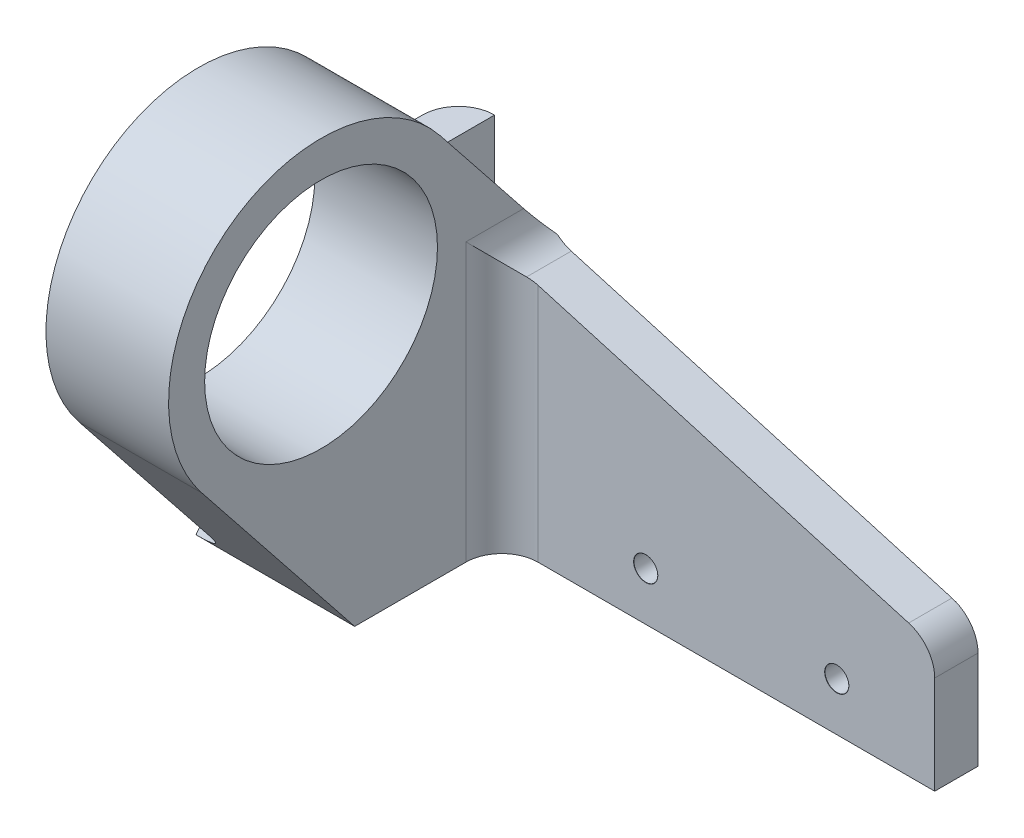
ISO-10303-21;
HEADER;
FILE_DESCRIPTION(('STEP AP214'),'2;1');
FILE_NAME('part.step','',(''),(''),'','','');
FILE_SCHEMA(('AUTOMOTIVE_DESIGN { 1 0 10303 214 1 1 1 1 }'));
ENDSEC;
DATA;
#1=APPLICATION_CONTEXT('core data for automotive mechanical design processes');
#2=APPLICATION_PROTOCOL_DEFINITION('international standard','automotive_design',2000,#1);
#3=PRODUCT_CONTEXT('',#1,'mechanical');
#4=PRODUCT('Part','Part','',(#3));
#5=PRODUCT_RELATED_PRODUCT_CATEGORY('part','',(#4));
#6=PRODUCT_DEFINITION_FORMATION('','',#4);
#7=PRODUCT_DEFINITION_CONTEXT('part definition',#1,'design');
#8=PRODUCT_DEFINITION('design','',#6,#7);
#9=PRODUCT_DEFINITION_SHAPE('','',#8);
#10=(LENGTH_UNIT() NAMED_UNIT(*) SI_UNIT(.MILLI.,.METRE.));
#11=(NAMED_UNIT(*) PLANE_ANGLE_UNIT() SI_UNIT($,.RADIAN.));
#12=(NAMED_UNIT(*) SI_UNIT($,.STERADIAN.) SOLID_ANGLE_UNIT());
#13=UNCERTAINTY_MEASURE_WITH_UNIT(LENGTH_MEASURE(1.E-05),#10,'distance_accuracy_value','');
#14=(GEOMETRIC_REPRESENTATION_CONTEXT(3) GLOBAL_UNCERTAINTY_ASSIGNED_CONTEXT((#13)) GLOBAL_UNIT_ASSIGNED_CONTEXT((#10,
#11,#12)) REPRESENTATION_CONTEXT('',''));
#15=CARTESIAN_POINT('',(0.,0.,0.));
#16=DIRECTION('',(0.,0.,1.));
#17=DIRECTION('',(1.,0.,0.));
#18=AXIS2_PLACEMENT_3D('',#15,#16,#17);
#19=CARTESIAN_POINT('',(0.,0.,0.));
#20=DIRECTION('',(1.,0.,0.));
#21=DIRECTION('',(0.,0.,-1.));
#22=AXIS2_PLACEMENT_3D('',#19,#20,#21);
#23=PLANE('',#22);
#24=CARTESIAN_POINT('',(0.,0.,0.));
#25=DIRECTION('',(1.,0.,0.));
#26=DIRECTION('',(0.,0.,-1.));
#27=AXIS2_PLACEMENT_3D('',#24,#25,#26);
#28=CIRCLE('',#27,16.14);
#29=CARTESIAN_POINT('',(0.,0.,-16.14));
#30=VERTEX_POINT('',#29);
#31=EDGE_CURVE('E304',#30,#30,#28,.T.);
#32=ORIENTED_EDGE('',*,*,#31,.T.);
#33=EDGE_LOOP('',(#32));
#34=FACE_BOUND('',#33,.T.);
#35=DIRECTION('',(0.,-0.782336644414112,-0.622855821845528));
#36=VECTOR('',#35,1.);
#37=CARTESIAN_POINT('',(0.,-5.09840064244887,-31.0806974157015));
#38=LINE('',#37,#36);
#39=CARTESIAN_POINT('',(0.,13.1671720738145,-16.5385966629143));
#40=VERTEX_POINT('',#39);
#41=CARTESIAN_POINT('',(0.,-1.06355098965173,-27.8683595884249));
#42=VERTEX_POINT('',#41);
#43=EDGE_CURVE('E281',#40,#42,#38,.T.);
#44=ORIENTED_EDGE('',*,*,#43,.T.);
#45=DIRECTION('',(0.,0.795666030089009,-0.605735559928915));
#46=VECTOR('',#45,1.);
#47=CARTESIAN_POINT('',(0.,-36.7697228428042,-0.685474832156144));
#48=LINE('',#47,#46);
#49=CARTESIAN_POINT('',(0.,-35.7635509896516,-1.45146715532457));
#50=VERTEX_POINT('',#49);
#51=EDGE_CURVE('E350',#42,#50,#48,.F.);
#52=ORIENTED_EDGE('',*,*,#51,.T.);
#53=DIRECTION('',(0.,0.782336644414111,0.622855821845528));
#54=VECTOR('',#53,1.);
#55=CARTESIAN_POINT('',(0.,-39.7984006424488,-4.66380498260119));
#56=LINE('',#55,#54);
#57=CARTESIAN_POINT('',(0.,-13.1671720738145,16.5385966629143));
#58=VERTEX_POINT('',#57);
#59=EDGE_CURVE('E276',#50,#58,#56,.T.);
#60=ORIENTED_EDGE('',*,*,#59,.T.);
#61=CARTESIAN_POINT('',(0.,0.,0.));
#62=DIRECTION('',(1.,0.,0.));
#63=DIRECTION('',(0.,0.,-1.));
#64=AXIS2_PLACEMENT_3D('',#61,#62,#63);
#65=CIRCLE('',#64,21.14);
#66=EDGE_CURVE('E308',#40,#58,#65,.T.);
#67=ORIENTED_EDGE('',*,*,#66,.F.);
#68=EDGE_LOOP('',(#44,#52,#60,#67));
#69=FACE_BOUND('',#68,.T.);
#70=ADVANCED_FACE('F34',(#34,#69),#23,.F.);
#71=CARTESIAN_POINT('',(17.,0.,0.));
#72=DIRECTION('',(-1.,0.,0.));
#73=DIRECTION('',(0.,0.,1.));
#74=AXIS2_PLACEMENT_3D('',#71,#72,#73);
#75=CYLINDRICAL_SURFACE('',#74,21.14);
#76=DIRECTION('',(-1.,0.,0.));
#77=VECTOR('',#76,1.);
#78=CARTESIAN_POINT('',(88.2246380244046,-13.1671720738145,16.5385966629143));
#79=LINE('',#78,#77);
#80=CARTESIAN_POINT('',(17.,-13.1671720738145,16.5385966629143));
#81=VERTEX_POINT('',#80);
#82=EDGE_CURVE('E286',#81,#58,#79,.T.);
#83=ORIENTED_EDGE('',*,*,#82,.F.);
#84=CARTESIAN_POINT('',(17.,0.,0.));
#85=DIRECTION('',(1.,0.,0.));
#86=DIRECTION('',(0.,0.,-1.));
#87=AXIS2_PLACEMENT_3D('',#84,#85,#86);
#88=CIRCLE('',#87,21.14);
#89=CARTESIAN_POINT('',(17.,13.1671720738145,-16.5385966629143));
#90=VERTEX_POINT('',#89);
#91=EDGE_CURVE('E311',#90,#81,#88,.T.);
#92=ORIENTED_EDGE('',*,*,#91,.F.);
#93=DIRECTION('',(-1.,0.,0.));
#94=VECTOR('',#93,1.);
#95=CARTESIAN_POINT('',(88.2246380244046,13.1671720738145,-16.5385966629143));
#96=LINE('',#95,#94);
#97=EDGE_CURVE('E295',#90,#40,#96,.T.);
#98=ORIENTED_EDGE('',*,*,#97,.T.);
#99=ORIENTED_EDGE('',*,*,#66,.T.);
#100=EDGE_LOOP('',(#83,#92,#98,#99));
#101=FACE_BOUND('',#100,.T.);
#102=ADVANCED_FACE('F443',(#101),#75,.T.);
#103=CARTESIAN_POINT('',(17.,0.,0.));
#104=DIRECTION('',(1.,0.,0.));
#105=DIRECTION('',(0.,0.,-1.));
#106=AXIS2_PLACEMENT_3D('',#103,#104,#105);
#107=PLANE('',#106);
#108=DIRECTION('',(0.,-1.,0.));
#109=VECTOR('',#108,1.);
#110=CARTESIAN_POINT('',(17.,0.,-20.0806974157015));
#111=LINE('',#110,#109);
#112=CARTESIAN_POINT('',(17.,-39.7984006424488,-20.0806974157015));
#113=VERTEX_POINT('',#112);
#114=CARTESIAN_POINT('',(17.,-1.33938680917127,-20.0806974157015));
#115=VERTEX_POINT('',#114);
#116=EDGE_CURVE('E329',#113,#115,#111,.F.);
#117=ORIENTED_EDGE('',*,*,#116,.T.);
#118=DIRECTION('',(0.,0.,1.));
#119=VECTOR('',#118,1.);
#120=CARTESIAN_POINT('',(17.,-1.33938680917127,0.));
#121=LINE('',#120,#119);
#122=CARTESIAN_POINT('',(17.,-1.33938680917127,-28.0879657481107));
#123=VERTEX_POINT('',#122);
#124=EDGE_CURVE('E331',#115,#123,#121,.F.);
#125=ORIENTED_EDGE('',*,*,#124,.T.);
#126=DIRECTION('',(0.,-0.782336644414112,-0.622855821845528));
#127=VECTOR('',#126,1.);
#128=CARTESIAN_POINT('',(17.,-5.09840064244887,-31.0806974157015));
#129=LINE('',#128,#127);
#130=EDGE_CURVE('E291',#90,#123,#129,.T.);
#131=ORIENTED_EDGE('',*,*,#130,.F.);
#132=ORIENTED_EDGE('',*,*,#91,.T.);
#133=DIRECTION('',(0.,0.782336644414111,0.622855821845528));
#134=VECTOR('',#133,1.);
#135=CARTESIAN_POINT('',(17.,-39.7984006424488,-4.66380498260119));
#136=LINE('',#135,#134);
#137=CARTESIAN_POINT('',(17.,-39.7984006424488,-4.66380498260119));
#138=VERTEX_POINT('',#137);
#139=EDGE_CURVE('E280',#138,#81,#136,.T.);
#140=ORIENTED_EDGE('',*,*,#139,.F.);
#141=DIRECTION('',(0.,0.,1.));
#142=VECTOR('',#141,1.);
#143=CARTESIAN_POINT('',(17.,-39.7984006424488,-31.0806974157015));
#144=LINE('',#143,#142);
#145=EDGE_CURVE('E287',#113,#138,#144,.T.);
#146=ORIENTED_EDGE('',*,*,#145,.F.);
#147=EDGE_LOOP('',(#117,#125,#131,#132,#140,#146));
#148=FACE_BOUND('',#147,.T.);
#149=CARTESIAN_POINT('',(17.,0.,0.));
#150=DIRECTION('',(1.,0.,0.));
#151=DIRECTION('',(0.,0.,-1.));
#152=AXIS2_PLACEMENT_3D('',#149,#150,#151);
#153=CIRCLE('',#152,16.14);
#154=CARTESIAN_POINT('',(17.,0.,-16.14));
#155=VERTEX_POINT('',#154);
#156=EDGE_CURVE('E305',#155,#155,#153,.T.);
#157=ORIENTED_EDGE('',*,*,#156,.F.);
#158=EDGE_LOOP('',(#157));
#159=FACE_BOUND('',#158,.T.);
#160=ADVANCED_FACE('F449',(#148,#159),#107,.T.);
#161=CARTESIAN_POINT('',(17.,0.,0.));
#162=DIRECTION('',(-1.,0.,0.));
#163=DIRECTION('',(0.,0.,1.));
#164=AXIS2_PLACEMENT_3D('',#161,#162,#163);
#165=CYLINDRICAL_SURFACE('',#164,16.14);
#166=ORIENTED_EDGE('',*,*,#156,.T.);
#167=EDGE_LOOP('',(#166));
#168=FACE_BOUND('',#167,.T.);
#169=ORIENTED_EDGE('',*,*,#31,.F.);
#170=EDGE_LOOP('',(#169));
#171=FACE_BOUND('',#170,.T.);
#172=ADVANCED_FACE('F644',(#168,#171),#165,.F.);
#173=CARTESIAN_POINT('',(88.2246380244046,-39.7984006424488,-4.66380498260119));
#174=DIRECTION('',(0.,-0.622855821845528,0.782336644414111));
#175=DIRECTION('',(0.,-0.782336644414111,-0.622855821845528));
#176=AXIS2_PLACEMENT_3D('',#173,#174,#175);
#177=PLANE('',#176);
#178=DIRECTION('',(-1.,0.,0.));
#179=VECTOR('',#178,1.);
#180=CARTESIAN_POINT('',(88.2246380244046,-39.7984006424488,-4.66380498260119));
#181=LINE('',#180,#179);
#182=CARTESIAN_POINT('',(-5.,-39.7984006424488,-4.66380498260119));
#183=VERTEX_POINT('',#182);
#184=EDGE_CURVE('E289',#138,#183,#181,.T.);
#185=ORIENTED_EDGE('',*,*,#184,.F.);
#186=ORIENTED_EDGE('',*,*,#139,.T.);
#187=ORIENTED_EDGE('',*,*,#82,.T.);
#188=ORIENTED_EDGE('',*,*,#59,.F.);
#189=CARTESIAN_POINT('',(-5.,-35.7635509896516,-1.45146715532457));
#190=DIRECTION('',(0.,-0.622855821845528,0.782336644414111));
#191=DIRECTION('',(0.,-0.782336644414111,-0.622855821845528));
#192=AXIS2_PLACEMENT_3D('',#189,#190,#191);
#193=ELLIPSE('',#192,5.15743405553861,5.);
#194=EDGE_CURVE('E353',#50,#183,#193,.F.);
#195=ORIENTED_EDGE('',*,*,#194,.T.);
#196=EDGE_LOOP('',(#185,#186,#187,#188,#195));
#197=FACE_BOUND('',#196,.T.);
#198=ADVANCED_FACE('F636',(#197),#177,.T.);
#199=CARTESIAN_POINT('',(88.2246380244046,-5.09840064244887,-31.0806974157015));
#200=DIRECTION('',(0.,0.622855821845528,-0.782336644414112));
#201=DIRECTION('',(0.,0.782336644414112,0.622855821845528));
#202=AXIS2_PLACEMENT_3D('',#199,#200,#201);
#203=PLANE('',#202);
#204=ORIENTED_EDGE('',*,*,#97,.F.);
#205=ORIENTED_EDGE('',*,*,#130,.T.);
#206=CARTESIAN_POINT('',(22.,-1.33938680917127,-28.0879657481107));
#207=DIRECTION('',(0.,0.622855821845528,-0.782336644414112));
#208=DIRECTION('',(0.,0.782336644414112,0.622855821845528));
#209=AXIS2_PLACEMENT_3D('',#206,#207,#208);
#210=ELLIPSE('',#209,6.3911105733063,5.);
#211=CARTESIAN_POINT('',(18.7030597516443,-5.09840064244887,-31.0806974157015));
#212=VERTEX_POINT('',#211);
#213=EDGE_CURVE('E333',#123,#212,#210,.F.);
#214=ORIENTED_EDGE('',*,*,#213,.T.);
#215=DIRECTION('',(-1.,0.,0.));
#216=VECTOR('',#215,1.);
#217=CARTESIAN_POINT('',(88.2246380244046,-5.09840064244887,-31.0806974157015));
#218=LINE('',#217,#216);
#219=CARTESIAN_POINT('',(0.,-5.09840064244887,-31.0806974157015));
#220=VERTEX_POINT('',#219);
#221=EDGE_CURVE('E294',#212,#220,#218,.T.);
#222=ORIENTED_EDGE('',*,*,#221,.T.);
#223=DIRECTION('',(-1.,0.,0.));
#224=VECTOR('',#223,1.);
#225=CARTESIAN_POINT('',(88.2246380244046,-5.09840064244887,-31.0806974157015));
#226=LINE('',#225,#224);
#227=CARTESIAN_POINT('',(-4.99999625658012,-5.09840064244887,-31.0806974157015));
#228=VERTEX_POINT('',#227);
#229=EDGE_CURVE('E213',#220,#228,#226,.T.);
#230=ORIENTED_EDGE('',*,*,#229,.T.);
#231=CARTESIAN_POINT('',(-5.,-1.06355098965172,-27.8683595884249));
#232=DIRECTION('',(0.,0.622855821845528,-0.782336644414112));
#233=DIRECTION('',(0.,-0.782336644414112,-0.622855821845528));
#234=AXIS2_PLACEMENT_3D('',#231,#232,#233);
#235=ELLIPSE('',#234,5.15743405553861,5.);
#236=EDGE_CURVE('E352',#228,#42,#235,.F.);
#237=ORIENTED_EDGE('',*,*,#236,.T.);
#238=ORIENTED_EDGE('',*,*,#43,.F.);
#239=EDGE_LOOP('',(#204,#205,#214,#222,#230,#237,#238));
#240=FACE_BOUND('',#239,.T.);
#241=ADVANCED_FACE('F363',(#240),#203,.T.);
#242=CARTESIAN_POINT('',(88.2246380244046,-39.7984006424488,-31.0806974157015));
#243=DIRECTION('',(0.,0.,-1.));
#244=DIRECTION('',(-1.,0.,0.));
#245=AXIS2_PLACEMENT_3D('',#242,#243,#244);
#246=PLANE('',#245);
#247=CARTESIAN_POINT('',(36.9325703904823,-33.0951279134987,-31.0806974157015));
#248=DIRECTION('',(0.,0.,-1.));
#249=DIRECTION('',(-1.,0.,0.));
#250=AXIS2_PLACEMENT_3D('',#247,#248,#249);
#251=CIRCLE('',#250,1.65);
#252=CARTESIAN_POINT('',(35.2825703904823,-33.0951279134987,-31.0806974157015));
#253=VERTEX_POINT('',#252);
#254=EDGE_CURVE('E38',#253,#253,#251,.T.);
#255=ORIENTED_EDGE('',*,*,#254,.F.);
#256=EDGE_LOOP('',(#255));
#257=FACE_BOUND('',#256,.T.);
#258=CARTESIAN_POINT('',(63.4183540434603,-33.0951279134987,-31.0806974157015));
#259=DIRECTION('',(0.,0.,-1.));
#260=DIRECTION('',(-1.,0.,0.));
#261=AXIS2_PLACEMENT_3D('',#258,#259,#260);
#262=CIRCLE('',#261,1.65);
#263=CARTESIAN_POINT('',(61.7683540434603,-33.0951279134987,-31.0806974157015));
#264=VERTEX_POINT('',#263);
#265=EDGE_CURVE('E190',#264,#264,#262,.T.);
#266=ORIENTED_EDGE('',*,*,#265,.F.);
#267=EDGE_LOOP('',(#266));
#268=FACE_BOUND('',#267,.T.);
#269=DIRECTION('',(-0.960643000638901,0.277785934351415,0.));
#270=VECTOR('',#269,1.);
#271=CARTESIAN_POINT('',(91.9883900664138,-26.7825434366535,-31.0806974157015));
#272=LINE('',#271,#270);
#273=CARTESIAN_POINT('',(73.3889296717571,-21.4041994725319,-31.0806974157015));
#274=VERTEX_POINT('',#273);
#275=CARTESIAN_POINT('',(20.6110703282429,-6.14260181236577,-31.0806974157015));
#276=VERTEX_POINT('',#275);
#277=EDGE_CURVE('E262',#274,#276,#272,.T.);
#278=ORIENTED_EDGE('',*,*,#277,.F.);
#279=CARTESIAN_POINT('',(72.,-26.2074144757264,-31.0806974157015));
#280=DIRECTION('',(0.,0.,-1.));
#281=DIRECTION('',(-1.,0.,0.));
#282=AXIS2_PLACEMENT_3D('',#279,#280,#281);
#283=CIRCLE('',#282,5.);
#284=CARTESIAN_POINT('',(77.,-26.2074144757264,-31.0806974157015));
#285=VERTEX_POINT('',#284);
#286=EDGE_CURVE('E327',#274,#285,#283,.T.);
#287=ORIENTED_EDGE('',*,*,#286,.T.);
#288=DIRECTION('',(0.,1.,0.));
#289=VECTOR('',#288,1.);
#290=CARTESIAN_POINT('',(77.,-5.09840064244887,-31.0806974157015));
#291=LINE('',#290,#289);
#292=CARTESIAN_POINT('',(77.,-39.7984006424488,-31.0806974157015));
#293=VERTEX_POINT('',#292);
#294=EDGE_CURVE('E265',#293,#285,#291,.T.);
#295=ORIENTED_EDGE('',*,*,#294,.F.);
#296=DIRECTION('',(-1.,0.,0.));
#297=VECTOR('',#296,1.);
#298=CARTESIAN_POINT('',(88.2246380244046,-39.7984006424488,-31.0806974157015));
#299=LINE('',#298,#297);
#300=CARTESIAN_POINT('',(0.,-39.7984006424488,-31.0806974157015));
#301=VERTEX_POINT('',#300);
#302=EDGE_CURVE('E290',#293,#301,#299,.T.);
#303=ORIENTED_EDGE('',*,*,#302,.T.);
#304=DIRECTION('',(0.,-1.,0.));
#305=VECTOR('',#304,1.);
#306=CARTESIAN_POINT('',(0.,-39.7984006424488,-31.0806974157015));
#307=LINE('',#306,#305);
#308=EDGE_CURVE('E277',#220,#301,#307,.T.);
#309=ORIENTED_EDGE('',*,*,#308,.F.);
#310=ORIENTED_EDGE('',*,*,#221,.F.);
#311=CARTESIAN_POINT('',(22.,-1.33938680917127,-31.0806974157015));
#312=DIRECTION('',(0.,0.,-1.));
#313=DIRECTION('',(-1.,0.,0.));
#314=AXIS2_PLACEMENT_3D('',#311,#312,#313);
#315=CIRCLE('',#314,5.);
#316=EDGE_CURVE('E336',#212,#276,#315,.F.);
#317=ORIENTED_EDGE('',*,*,#316,.T.);
#318=EDGE_LOOP('',(#278,#287,#295,#303,#309,#310,#317));
#319=FACE_BOUND('',#318,.T.);
#320=ADVANCED_FACE('F415',(#257,#268,#319),#246,.T.);
#321=CARTESIAN_POINT('',(88.2246380244046,-39.7984006424488,-31.0806974157015));
#322=DIRECTION('',(0.,-1.,0.));
#323=DIRECTION('',(0.,0.,-1.));
#324=AXIS2_PLACEMENT_3D('',#321,#322,#323);
#325=PLANE('',#324);
#326=DIRECTION('',(0.,0.,1.));
#327=VECTOR('',#326,1.);
#328=CARTESIAN_POINT('',(-5.,-39.7984006424488,-25.5019193282351));
#329=LINE('',#328,#327);
#330=CARTESIAN_POINT('',(-5.,-39.7984006424488,-36.0665139599191));
#331=VERTEX_POINT('',#330);
#332=EDGE_CURVE('E243',#331,#183,#329,.T.);
#333=ORIENTED_EDGE('',*,*,#332,.F.);
#334=CARTESIAN_POINT('',(0.,-39.7984006424488,-36.0665139599191));
#335=DIRECTION('',(0.,-1.,0.));
#336=DIRECTION('',(0.,0.,-1.));
#337=AXIS2_PLACEMENT_3D('',#334,#335,#336);
#338=CIRCLE('',#337,5.);
#339=CARTESIAN_POINT('',(0.,-39.7984006424488,-41.0665139599191));
#340=VERTEX_POINT('',#339);
#341=EDGE_CURVE('E346',#331,#340,#338,.T.);
#342=ORIENTED_EDGE('',*,*,#341,.T.);
#343=DIRECTION('',(0.,0.,1.));
#344=VECTOR('',#343,1.);
#345=CARTESIAN_POINT('',(0.,-39.7984006424488,-4.66380498260119));
#346=LINE('',#345,#344);
#347=EDGE_CURVE('E255',#340,#301,#346,.T.);
#348=ORIENTED_EDGE('',*,*,#347,.T.);
#349=ORIENTED_EDGE('',*,*,#302,.F.);
#350=DIRECTION('',(0.,0.,-1.));
#351=VECTOR('',#350,1.);
#352=CARTESIAN_POINT('',(77.,-39.7984006424488,-31.0806974157015));
#353=LINE('',#352,#351);
#354=CARTESIAN_POINT('',(77.,-39.7984006424488,-25.0806974157015));
#355=VERTEX_POINT('',#354);
#356=EDGE_CURVE('E270',#355,#293,#353,.T.);
#357=ORIENTED_EDGE('',*,*,#356,.F.);
#358=DIRECTION('',(-1.,0.,0.));
#359=VECTOR('',#358,1.);
#360=CARTESIAN_POINT('',(77.,-39.7984006424488,-25.0806974157015));
#361=LINE('',#360,#359);
#362=CARTESIAN_POINT('',(22.,-39.7984006424488,-25.0806974157015));
#363=VERTEX_POINT('',#362);
#364=EDGE_CURVE('E273',#355,#363,#361,.T.);
#365=ORIENTED_EDGE('',*,*,#364,.T.);
#366=CARTESIAN_POINT('',(22.,-39.7984006424488,-20.0806974157015));
#367=DIRECTION('',(0.,-1.,0.));
#368=DIRECTION('',(0.,0.,-1.));
#369=AXIS2_PLACEMENT_3D('',#366,#367,#368);
#370=CIRCLE('',#369,5.);
#371=EDGE_CURVE('E338',#363,#113,#370,.F.);
#372=ORIENTED_EDGE('',*,*,#371,.T.);
#373=ORIENTED_EDGE('',*,*,#145,.T.);
#374=ORIENTED_EDGE('',*,*,#184,.T.);
#375=EDGE_LOOP('',(#333,#342,#348,#349,#357,#365,#372,#373,#374));
#376=FACE_BOUND('',#375,.T.);
#377=ADVANCED_FACE('F395',(#376),#325,.T.);
#378=CARTESIAN_POINT('',(77.,-5.09840064244887,-25.0806974157015));
#379=DIRECTION('',(0.,0.,-1.));
#380=DIRECTION('',(0.,1.,0.));
#381=AXIS2_PLACEMENT_3D('',#378,#379,#380);
#382=PLANE('',#381);
#383=CARTESIAN_POINT('',(36.9325703904823,-33.0951279134987,-25.0806974157015));
#384=DIRECTION('',(0.,0.,1.));
#385=DIRECTION('',(1.,0.,0.));
#386=AXIS2_PLACEMENT_3D('',#383,#384,#385);
#387=CIRCLE('',#386,1.675);
#388=CARTESIAN_POINT('',(38.6075703904823,-33.0951279134987,-25.0806974157015));
#389=VERTEX_POINT('',#388);
#390=EDGE_CURVE('E385',#389,#389,#387,.T.);
#391=ORIENTED_EDGE('',*,*,#390,.F.);
#392=EDGE_LOOP('',(#391));
#393=FACE_BOUND('',#392,.T.);
#394=CARTESIAN_POINT('',(63.4183540434603,-33.0951279134987,-25.0806974157015));
#395=DIRECTION('',(0.,0.,1.));
#396=DIRECTION('',(1.,0.,0.));
#397=AXIS2_PLACEMENT_3D('',#394,#395,#396);
#398=CIRCLE('',#397,1.675);
#399=CARTESIAN_POINT('',(65.0933540434603,-33.0951279134987,-25.0806974157015));
#400=VERTEX_POINT('',#399);
#401=EDGE_CURVE('E379',#400,#400,#398,.T.);
#402=ORIENTED_EDGE('',*,*,#401,.F.);
#403=EDGE_LOOP('',(#402));
#404=FACE_BOUND('',#403,.T.);
#405=DIRECTION('',(0.,-1.,0.));
#406=VECTOR('',#405,1.);
#407=CARTESIAN_POINT('',(77.,-5.09840064244887,-25.0806974157015));
#408=LINE('',#407,#406);
#409=CARTESIAN_POINT('',(77.,-26.2074144757264,-25.0806974157015));
#410=VERTEX_POINT('',#409);
#411=EDGE_CURVE('E268',#410,#355,#408,.T.);
#412=ORIENTED_EDGE('',*,*,#411,.F.);
#413=CARTESIAN_POINT('',(72.,-26.2074144757264,-25.0806974157015));
#414=DIRECTION('',(0.,0.,-1.));
#415=DIRECTION('',(0.,1.,0.));
#416=AXIS2_PLACEMENT_3D('',#413,#414,#415);
#417=CIRCLE('',#416,5.);
#418=CARTESIAN_POINT('',(73.3889296717571,-21.4041994725319,-25.0806974157015));
#419=VERTEX_POINT('',#418);
#420=EDGE_CURVE('E321',#410,#419,#417,.F.);
#421=ORIENTED_EDGE('',*,*,#420,.T.);
#422=DIRECTION('',(0.960643000638901,-0.277785934351415,0.));
#423=VECTOR('',#422,1.);
#424=CARTESIAN_POINT('',(17.,-5.09840064244887,-25.0806974157015));
#425=LINE('',#424,#423);
#426=CARTESIAN_POINT('',(22.,-6.5442339757822,-25.0806974157015));
#427=VERTEX_POINT('',#426);
#428=EDGE_CURVE('E259',#427,#419,#425,.T.);
#429=ORIENTED_EDGE('',*,*,#428,.F.);
#430=DIRECTION('',(0.,-1.,0.));
#431=VECTOR('',#430,1.);
#432=CARTESIAN_POINT('',(22.,-5.09840064244887,-25.0806974157015));
#433=LINE('',#432,#431);
#434=EDGE_CURVE('E319',#427,#363,#433,.T.);
#435=ORIENTED_EDGE('',*,*,#434,.T.);
#436=ORIENTED_EDGE('',*,*,#364,.F.);
#437=EDGE_LOOP('',(#412,#421,#429,#435,#436));
#438=FACE_BOUND('',#437,.T.);
#439=ADVANCED_FACE('F391',(#393,#404,#438),#382,.F.);
#440=CARTESIAN_POINT('',(77.,0.,0.));
#441=DIRECTION('',(-1.,0.,0.));
#442=DIRECTION('',(0.,0.,1.));
#443=AXIS2_PLACEMENT_3D('',#440,#441,#442);
#444=PLANE('',#443);
#445=ORIENTED_EDGE('',*,*,#294,.T.);
#446=DIRECTION('',(0.,0.,1.));
#447=VECTOR('',#446,1.);
#448=CARTESIAN_POINT('',(77.,-26.2074144757264,0.));
#449=LINE('',#448,#447);
#450=EDGE_CURVE('E314',#285,#410,#449,.T.);
#451=ORIENTED_EDGE('',*,*,#450,.T.);
#452=ORIENTED_EDGE('',*,*,#411,.T.);
#453=ORIENTED_EDGE('',*,*,#356,.T.);
#454=EDGE_LOOP('',(#445,#451,#452,#453));
#455=FACE_BOUND('',#454,.T.);
#456=ADVANCED_FACE('F394',(#455),#444,.F.);
#457=CARTESIAN_POINT('',(17.,-5.09840064244887,-55.0806974157015));
#458=DIRECTION('',(-0.277785934351415,-0.960643000638901,0.));
#459=DIRECTION('',(0.960643000638901,-0.277785934351415,0.));
#460=AXIS2_PLACEMENT_3D('',#457,#458,#459);
#461=PLANE('',#460);
#462=ORIENTED_EDGE('',*,*,#428,.T.);
#463=DIRECTION('',(0.,0.,1.));
#464=VECTOR('',#463,1.);
#465=CARTESIAN_POINT('',(73.3889296717571,-21.4041994725319,-55.0806974157015));
#466=LINE('',#465,#464);
#467=EDGE_CURVE('E325',#419,#274,#466,.F.);
#468=ORIENTED_EDGE('',*,*,#467,.T.);
#469=ORIENTED_EDGE('',*,*,#277,.T.);
#470=DIRECTION('',(0.,0.,1.));
#471=VECTOR('',#470,1.);
#472=CARTESIAN_POINT('',(20.6110703282429,-6.14260181236578,-55.0806974157015));
#473=LINE('',#472,#471);
#474=CARTESIAN_POINT('',(20.6110703282429,-6.14260181236578,-24.883912418896));
#475=VERTEX_POINT('',#474);
#476=EDGE_CURVE('E323',#276,#475,#473,.T.);
#477=ORIENTED_EDGE('',*,*,#476,.T.);
#478=CARTESIAN_POINT('',(22.,-6.5442339757822,-20.0806974157015));
#479=DIRECTION('',(-0.277785934351415,-0.960643000638901,0.));
#480=DIRECTION('',(0.960643000638901,-0.277785934351415,0.));
#481=AXIS2_PLACEMENT_3D('',#478,#479,#480);
#482=ELLIPSE('',#481,5.20484716661092,5.);
#483=EDGE_CURVE('E340',#475,#427,#482,.T.);
#484=ORIENTED_EDGE('',*,*,#483,.T.);
#485=EDGE_LOOP('',(#462,#468,#469,#477,#484));
#486=FACE_BOUND('',#485,.T.);
#487=ADVANCED_FACE('F412',(#486),#461,.F.);
#488=CARTESIAN_POINT('',(72.,-26.2074144757264,0.));
#489=DIRECTION('',(0.,0.,1.));
#490=DIRECTION('',(1.,0.,0.));
#491=AXIS2_PLACEMENT_3D('',#488,#489,#490);
#492=CYLINDRICAL_SURFACE('',#491,5.);
#493=ORIENTED_EDGE('',*,*,#286,.F.);
#494=ORIENTED_EDGE('',*,*,#467,.F.);
#495=ORIENTED_EDGE('',*,*,#420,.F.);
#496=ORIENTED_EDGE('',*,*,#450,.F.);
#497=EDGE_LOOP('',(#493,#494,#495,#496));
#498=FACE_BOUND('',#497,.T.);
#499=ADVANCED_FACE('F408',(#498),#492,.T.);
#500=CARTESIAN_POINT('',(22.,-5.09840064244887,-20.0806974157015));
#501=DIRECTION('',(0.,-1.,0.));
#502=DIRECTION('',(0.,0.,-1.));
#503=AXIS2_PLACEMENT_3D('',#500,#501,#502);
#504=CYLINDRICAL_SURFACE('',#503,5.);
#505=ORIENTED_EDGE('',*,*,#434,.F.);
#506=ORIENTED_EDGE('',*,*,#483,.F.);
#507=CARTESIAN_POINT('',(22.,-1.33938680917127,-20.0806974157015));
#508=DIRECTION('',(0.,-0.707106781186547,0.707106781186547));
#509=DIRECTION('',(0.,-0.707106781186548,-0.707106781186547));
#510=AXIS2_PLACEMENT_3D('',#507,#508,#509);
#511=ELLIPSE('',#510,7.07106781186547,5.);
#512=EDGE_CURVE('E252',#115,#475,#511,.T.);
#513=ORIENTED_EDGE('',*,*,#512,.F.);
#514=ORIENTED_EDGE('',*,*,#116,.F.);
#515=ORIENTED_EDGE('',*,*,#371,.F.);
#516=EDGE_LOOP('',(#505,#506,#513,#514,#515));
#517=FACE_BOUND('',#516,.T.);
#518=ADVANCED_FACE('F425',(#517),#504,.F.);
#519=CARTESIAN_POINT('',(22.,-1.33938680917127,-55.0806974157015));
#520=DIRECTION('',(0.,0.,1.));
#521=DIRECTION('',(1.,0.,0.));
#522=AXIS2_PLACEMENT_3D('',#519,#520,#521);
#523=CYLINDRICAL_SURFACE('',#522,5.);
#524=ORIENTED_EDGE('',*,*,#213,.F.);
#525=ORIENTED_EDGE('',*,*,#124,.F.);
#526=ORIENTED_EDGE('',*,*,#512,.T.);
#527=ORIENTED_EDGE('',*,*,#476,.F.);
#528=ORIENTED_EDGE('',*,*,#316,.F.);
#529=EDGE_LOOP('',(#524,#525,#526,#527,#528));
#530=FACE_BOUND('',#529,.T.);
#531=ADVANCED_FACE('F419',(#530),#523,.F.);
#532=CARTESIAN_POINT('',(-5.,-5.09840064244887,-31.0806974157015));
#533=DIRECTION('',(0.,-1.,0.));
#534=DIRECTION('',(0.,0.,-1.));
#535=AXIS2_PLACEMENT_3D('',#532,#533,#534);
#536=PLANE('',#535);
#537=DIRECTION('',(0.,0.,-1.));
#538=VECTOR('',#537,1.);
#539=CARTESIAN_POINT('',(0.,-5.09840064244887,-31.0806974157015));
#540=LINE('',#539,#538);
#541=CARTESIAN_POINT('',(0.,-5.09840064244887,-41.0665139599191));
#542=VERTEX_POINT('',#541);
#543=EDGE_CURVE('E246',#220,#542,#540,.T.);
#544=ORIENTED_EDGE('',*,*,#543,.T.);
#545=CARTESIAN_POINT('',(0.,-5.09840064244887,-36.0665139599191));
#546=DIRECTION('',(0.,-1.,0.));
#547=DIRECTION('',(0.,0.,-1.));
#548=AXIS2_PLACEMENT_3D('',#545,#546,#547);
#549=CIRCLE('',#548,5.);
#550=CARTESIAN_POINT('',(-5.,-5.09840064244887,-36.0665139599191));
#551=VERTEX_POINT('',#550);
#552=EDGE_CURVE('E348',#542,#551,#549,.F.);
#553=ORIENTED_EDGE('',*,*,#552,.T.);
#554=DIRECTION('',(0.,0.,-1.));
#555=VECTOR('',#554,1.);
#556=CARTESIAN_POINT('',(-5.,-5.09840064244887,-31.0806974157015));
#557=LINE('',#556,#555);
#558=EDGE_CURVE('E249',#228,#551,#557,.T.);
#559=ORIENTED_EDGE('',*,*,#558,.F.);
#560=ORIENTED_EDGE('',*,*,#229,.F.);
#561=EDGE_LOOP('',(#544,#553,#559,#560));
#562=FACE_BOUND('',#561,.T.);
#563=ADVANCED_FACE('F370',(#562),#536,.F.);
#564=CARTESIAN_POINT('',(-5.,0.,0.));
#565=DIRECTION('',(1.,0.,0.));
#566=DIRECTION('',(0.,0.,-1.));
#567=AXIS2_PLACEMENT_3D('',#564,#565,#566);
#568=PLANE('',#567);
#569=DIRECTION('',(0.,-1.,0.));
#570=VECTOR('',#569,1.);
#571=CARTESIAN_POINT('',(-5.,0.,-36.0665139599191));
#572=LINE('',#571,#570);
#573=CARTESIAN_POINT('',(-5.,-13.2951970931989,-36.0665139599191));
#574=VERTEX_POINT('',#573);
#575=EDGE_CURVE('E344',#551,#574,#572,.T.);
#576=ORIENTED_EDGE('',*,*,#575,.T.);
#577=CARTESIAN_POINT('',(-5.,-14.7012785400326,-35.1562612670529));
#578=DIRECTION('',(-1.,0.,0.));
#579=DIRECTION('',(0.,0.,1.));
#580=AXIS2_PLACEMENT_3D('',#577,#578,#579);
#581=CIRCLE('',#580,1.675);
#582=CARTESIAN_POINT('',(-5.,-16.1073599868663,-36.0665139599191));
#583=VERTEX_POINT('',#582);
#584=EDGE_CURVE('E164',#583,#574,#581,.T.);
#585=ORIENTED_EDGE('',*,*,#584,.F.);
#586=CARTESIAN_POINT('',(-5.,-32.7006095472992,-36.0665139599191));
#587=VERTEX_POINT('',#586);
#588=EDGE_CURVE('E235',#583,#587,#572,.T.);
#589=ORIENTED_EDGE('',*,*,#588,.T.);
#590=CARTESIAN_POINT('',(-5.,-34.1066909941329,-35.1562612670529));
#591=DIRECTION('',(-1.,0.,0.));
#592=DIRECTION('',(0.,0.,1.));
#593=AXIS2_PLACEMENT_3D('',#590,#591,#592);
#594=CIRCLE('',#593,1.675);
#595=CARTESIAN_POINT('',(-5.,-35.5127724409666,-36.0665139599191));
#596=VERTEX_POINT('',#595);
#597=EDGE_CURVE('E225',#596,#587,#594,.T.);
#598=ORIENTED_EDGE('',*,*,#597,.F.);
#599=EDGE_CURVE('E231',#596,#331,#572,.T.);
#600=ORIENTED_EDGE('',*,*,#599,.T.);
#601=ORIENTED_EDGE('',*,*,#332,.T.);
#602=DIRECTION('',(0.,0.795666030089009,-0.605735559928915));
#603=VECTOR('',#602,1.);
#604=CARTESIAN_POINT('',(-5.,-5.09840064244887,-31.0806974157015));
#605=LINE('',#604,#603);
#606=EDGE_CURVE('E245',#183,#228,#605,.T.);
#607=ORIENTED_EDGE('',*,*,#606,.T.);
#608=ORIENTED_EDGE('',*,*,#558,.T.);
#609=EDGE_LOOP('',(#576,#585,#589,#598,#600,#601,#607,#608));
#610=FACE_BOUND('',#609,.T.);
#611=ADVANCED_FACE('F233',(#610),#568,.F.);
#612=CARTESIAN_POINT('',(0.,0.,0.));
#613=DIRECTION('',(1.,0.,0.));
#614=DIRECTION('',(0.,0.,-1.));
#615=AXIS2_PLACEMENT_3D('',#612,#613,#614);
#616=PLANE('',#615);
#617=CARTESIAN_POINT('',(0.,-14.7012785400326,-35.1562612670529));
#618=DIRECTION('',(-1.,0.,0.));
#619=DIRECTION('',(0.,0.,1.));
#620=AXIS2_PLACEMENT_3D('',#617,#618,#619);
#621=CIRCLE('',#620,1.65);
#622=CARTESIAN_POINT('',(0.,-14.7012785400326,-33.5062612670529));
#623=VERTEX_POINT('',#622);
#624=EDGE_CURVE('E173',#623,#623,#621,.T.);
#625=ORIENTED_EDGE('',*,*,#624,.T.);
#626=EDGE_LOOP('',(#625));
#627=FACE_BOUND('',#626,.T.);
#628=CARTESIAN_POINT('',(0.,-34.1066909941329,-35.1562612670529));
#629=DIRECTION('',(-1.,0.,0.));
#630=DIRECTION('',(0.,0.,1.));
#631=AXIS2_PLACEMENT_3D('',#628,#629,#630);
#632=CIRCLE('',#631,1.65);
#633=CARTESIAN_POINT('',(0.,-34.1066909941329,-33.5062612670529));
#634=VERTEX_POINT('',#633);
#635=EDGE_CURVE('E227',#634,#634,#632,.T.);
#636=ORIENTED_EDGE('',*,*,#635,.T.);
#637=EDGE_LOOP('',(#636));
#638=FACE_BOUND('',#637,.T.);
#639=ORIENTED_EDGE('',*,*,#543,.F.);
#640=ORIENTED_EDGE('',*,*,#308,.T.);
#641=ORIENTED_EDGE('',*,*,#347,.F.);
#642=DIRECTION('',(0.,-1.,0.));
#643=VECTOR('',#642,1.);
#644=CARTESIAN_POINT('',(0.,-5.09840064244887,-41.0665139599191));
#645=LINE('',#644,#643);
#646=EDGE_CURVE('E242',#542,#340,#645,.T.);
#647=ORIENTED_EDGE('',*,*,#646,.F.);
#648=EDGE_LOOP('',(#639,#640,#641,#647));
#649=FACE_BOUND('',#648,.T.);
#650=ADVANCED_FACE('F432',(#627,#638,#649),#616,.T.);
#651=CARTESIAN_POINT('',(0.,0.,-36.0665139599191));
#652=DIRECTION('',(0.,-1.,0.));
#653=DIRECTION('',(0.,0.,-1.));
#654=AXIS2_PLACEMENT_3D('',#651,#652,#653);
#655=CYLINDRICAL_SURFACE('',#654,5.);
#656=CARTESIAN_POINT('',(-4.99013125255214,-13.1485921335942,-35.7525233831459));
#657=CARTESIAN_POINT('',(-4.99272627883733,-13.1610871624393,-35.7936996278648));
#658=CARTESIAN_POINT('',(-4.99475781851407,-13.1758264474867,-35.8341868643061));
#659=CARTESIAN_POINT('',(-4.99781156502614,-13.2094787919129,-35.9134099341133));
#660=CARTESIAN_POINT('',(-4.99883421706721,-13.2283900057751,-35.9521465328));
#661=CARTESIAN_POINT('',(-5.00049420353154,-13.2882760050147,-36.0604267057544));
#662=CARTESIAN_POINT('',(-5.00001639310766,-13.3341026830495,-36.127353173725));
#663=CARTESIAN_POINT('',(-4.99694604263818,-13.4367408227092,-36.2521339557727));
#664=CARTESIAN_POINT('',(-4.99435016280634,-13.4935695243836,-36.309973770062));
#665=CARTESIAN_POINT('',(-4.98910535250436,-13.5955903965786,-36.3983111687323));
#666=CARTESIAN_POINT('',(-4.98675398833764,-13.6384724800928,-36.4315489787964));
#667=CARTESIAN_POINT('',(-4.98183789709841,-13.7273662742855,-36.4934232882216));
#668=CARTESIAN_POINT('',(-4.97927332591888,-13.7733756939018,-36.5220631054099));
#669=CARTESIAN_POINT('',(-4.97210029609417,-13.9065521261456,-36.5961790370314));
#670=CARTESIAN_POINT('',(-4.96752853048367,-13.9967176651385,-36.6363672973272));
#671=CARTESIAN_POINT('',(-4.95963664680327,-14.1825755364665,-36.7013977471571));
#672=CARTESIAN_POINT('',(-4.95631911953505,-14.2782788429902,-36.7262082386222));
#673=CARTESIAN_POINT('',(-4.95163438816901,-14.4730529316016,-36.7605025556018));
#674=CARTESIAN_POINT('',(-4.95027947562828,-14.5721409919469,-36.7698898366074));
#675=CARTESIAN_POINT('',(-4.94983128235646,-14.7705236918936,-36.7730341724031));
#676=CARTESIAN_POINT('',(-4.95073721161681,-14.8698182472243,-36.7667966869706));
#677=CARTESIAN_POINT('',(-4.9547432555105,-15.0717839930204,-36.7378937641847));
#678=CARTESIAN_POINT('',(-4.95796591008183,-15.1743234641372,-36.7143090816666));
#679=CARTESIAN_POINT('',(-4.96598825459961,-15.3738272491742,-36.6496265242936));
#680=CARTESIAN_POINT('',(-4.9707894303318,-15.4707862090038,-36.6085121387119));
#681=CARTESIAN_POINT('',(-4.98045408495645,-15.6518045944307,-36.51079997187));
#682=CARTESIAN_POINT('',(-4.98530800623347,-15.7362174664932,-36.4548610720011));
#683=CARTESIAN_POINT('',(-4.99358817825919,-15.8922171666939,-36.3274981771448));
#684=CARTESIAN_POINT('',(-4.99702026582017,-15.9638557304506,-36.2561393578555));
#685=CARTESIAN_POINT('',(-4.99990764729575,-16.068322681579,-36.1262256348552));
#686=CARTESIAN_POINT('',(-5.00032036911339,-16.10605250154,-36.0716116589671));
#687=CARTESIAN_POINT('',(-4.99913423029912,-16.1728344706245,-35.9569738888719));
#688=CARTESIAN_POINT('',(-4.99752487945451,-16.2018403909472,-35.8969233951639));
#689=CARTESIAN_POINT('',(-4.99462624136225,-16.2256957878396,-35.8347625648951));
#690=B_SPLINE_CURVE_WITH_KNOTS('',3,(#656,#657,#658,#659,#660,#661,#662,#663,#664,#665,#666,
#667,#668,#669,#670,#671,#672,#673,#674,#675,#676,#677,#678,#679,#680,#681,#682,#683,#684,#685,
#686,#687,#688,#689),.UNSPECIFIED.,.F.,.F.,(4,2,2,2,2,2,2,2,2,2,2,2,2,2,2,2,4),(0.,
0.129186971788866,0.258316909928013,0.500139792059882,0.742344720729568,0.904983686485258,
1.0675047622955,1.36240508592179,1.6579112809926,1.95526030177824,2.25250543410244,
2.56675250317748,2.88129620871738,3.18369914210041,3.48484806752997,3.6832264155951,
3.88263818349651),.UNSPECIFIED.);
#691=CARTESIAN_POINT('',(-4.97902250922057,-13.7784204459163,-36.5240452186052));
#692=VERTEX_POINT('',#691);
#693=EDGE_CURVE('E11',#574,#692,#690,.T.);
#694=ORIENTED_EDGE('',*,*,#693,.F.);
#695=ORIENTED_EDGE('',*,*,#575,.F.);
#696=ORIENTED_EDGE('',*,*,#552,.F.);
#697=ORIENTED_EDGE('',*,*,#646,.T.);
#698=ORIENTED_EDGE('',*,*,#341,.F.);
#699=ORIENTED_EDGE('',*,*,#599,.F.);
#700=CARTESIAN_POINT('',(-4.99013125255214,-32.5540045876945,-35.7525233831458));
#701=CARTESIAN_POINT('',(-4.99272627883733,-32.5664996165396,-35.7936996278648));
#702=CARTESIAN_POINT('',(-4.99475781851407,-32.581238901587,-35.8341868643061));
#703=CARTESIAN_POINT('',(-4.99781156502613,-32.6148912460132,-35.9134099341133));
#704=CARTESIAN_POINT('',(-4.99883421706721,-32.6338024598754,-35.9521465327999));
#705=CARTESIAN_POINT('',(-5.00049420353154,-32.693688459115,-36.0604267057544));
#706=CARTESIAN_POINT('',(-5.00001639310766,-32.7395151371498,-36.127353173725));
#707=CARTESIAN_POINT('',(-4.99694604263818,-32.8421532768095,-36.2521339557727));
#708=CARTESIAN_POINT('',(-4.99435016280634,-32.8989819784839,-36.309973770062));
#709=CARTESIAN_POINT('',(-4.98910535250436,-33.0010028506789,-36.3983111687322));
#710=CARTESIAN_POINT('',(-4.98675398833764,-33.0438849341931,-36.4315489787964));
#711=CARTESIAN_POINT('',(-4.98183789709841,-33.1327787283858,-36.4934232882216));
#712=CARTESIAN_POINT('',(-4.97927332591888,-33.1787881480021,-36.5220631054099));
#713=CARTESIAN_POINT('',(-4.97210029609417,-33.3119645802459,-36.5961790370314));
#714=CARTESIAN_POINT('',(-4.96752853048367,-33.4021301192388,-36.6363672973272));
#715=CARTESIAN_POINT('',(-4.95963664680327,-33.5879879905668,-36.7013977471571));
#716=CARTESIAN_POINT('',(-4.95631911953505,-33.6836912970905,-36.7262082386222));
#717=CARTESIAN_POINT('',(-4.95163438816901,-33.8784653857019,-36.7605025556018));
#718=CARTESIAN_POINT('',(-4.95027947562829,-33.9775534460472,-36.7698898366074));
#719=CARTESIAN_POINT('',(-4.94983128235646,-34.1759361459939,-36.7730341724031));
#720=CARTESIAN_POINT('',(-4.95073721161681,-34.2752307013246,-36.7667966869706));
#721=CARTESIAN_POINT('',(-4.9547432555105,-34.4771964471207,-36.7378937641847));
#722=CARTESIAN_POINT('',(-4.95796591008183,-34.5797359182375,-36.7143090816666));
#723=CARTESIAN_POINT('',(-4.96598825459961,-34.7792397032745,-36.6496265242935));
#724=CARTESIAN_POINT('',(-4.9707894303318,-34.8761986631041,-36.6085121387119));
#725=CARTESIAN_POINT('',(-4.98045408495646,-35.057217048531,-36.51079997187));
#726=CARTESIAN_POINT('',(-4.98530800623347,-35.1416299205936,-36.4548610720011));
#727=CARTESIAN_POINT('',(-4.9935881782592,-35.2976296207943,-36.3274981771448));
#728=CARTESIAN_POINT('',(-4.99702026582017,-35.3692681845509,-36.2561393578554));
#729=CARTESIAN_POINT('',(-4.99990764729575,-35.4737351356793,-36.1262256348552));
#730=CARTESIAN_POINT('',(-5.00032036911339,-35.5114649556403,-36.0716116589671));
#731=CARTESIAN_POINT('',(-4.99913423029912,-35.5782469247248,-35.9569738888719));
#732=CARTESIAN_POINT('',(-4.99752487945451,-35.6072528450475,-35.8969233951639));
#733=CARTESIAN_POINT('',(-4.99462624136225,-35.6311082419399,-35.8347625648951));
#734=B_SPLINE_CURVE_WITH_KNOTS('',3,(#700,#701,#702,#703,#704,#705,#706,#707,#708,#709,#710,
#711,#712,#713,#714,#715,#716,#717,#718,#719,#720,#721,#722,#723,#724,#725,#726,#727,#728,#729,
#730,#731,#732,#733),.UNSPECIFIED.,.F.,.F.,(4,2,2,2,2,2,2,2,2,2,2,2,2,2,2,2,4),(0.,
0.129186971788858,0.258316909928019,0.500139792059888,0.742344720729564,0.90498368648526,
1.06750476229552,1.36240508592182,1.65791128099264,1.95526030177827,2.25250543410247,
2.56675250317752,2.88129620871742,3.18369914210047,3.48484806753002,3.68322641559514,
3.88263818349653),.UNSPECIFIED.);
#735=CARTESIAN_POINT('',(-4.97902250922056,-35.0295490882492,-36.5240452186053));
#736=VERTEX_POINT('',#735);
#737=EDGE_CURVE('E206',#736,#596,#734,.T.);
#738=ORIENTED_EDGE('',*,*,#737,.F.);
#739=CARTESIAN_POINT('',(-4.97902250922057,-33.1838329000166,-36.5240452186052));
#740=CARTESIAN_POINT('',(-4.97664374002868,-33.2221796292536,-36.5499172059799));
#741=CARTESIAN_POINT('',(-4.97421400220145,-33.2615935759919,-36.5741630077713));
#742=CARTESIAN_POINT('',(-4.96940479169727,-33.3423189441468,-36.6192635565266));
#743=CARTESIAN_POINT('',(-4.96702531906267,-33.3836303671621,-36.6401183006335));
#744=CARTESIAN_POINT('',(-4.9601961456313,-33.5099529013649,-36.6973414689517));
#745=CARTESIAN_POINT('',(-4.95604916951718,-33.5974466207721,-36.7284323643414));
#746=CARTESIAN_POINT('',(-4.94953107294072,-33.7764902980587,-36.7755368629155));
#747=CARTESIAN_POINT('',(-4.9471612067112,-33.8680430725267,-36.7915398195142));
#748=CARTESIAN_POINT('',(-4.94472606290481,-34.0525572022948,-36.8079690049979));
#749=CARTESIAN_POINT('',(-4.94466011581541,-34.1455181405303,-36.8083997591231));
#750=CARTESIAN_POINT('',(-4.94683714982553,-34.3294668538145,-36.7937373769651));
#751=CARTESIAN_POINT('',(-4.94906301030247,-34.4204641495821,-36.7787593504869));
#752=CARTESIAN_POINT('',(-4.95531179431345,-34.5986337103834,-36.7338916100742));
#753=CARTESIAN_POINT('',(-4.95933385624985,-34.6858077873385,-36.7040090447115));
#754=CARTESIAN_POINT('',(-4.96620220540297,-34.8151950695326,-36.6472297380589));
#755=CARTESIAN_POINT('',(-4.96873919261597,-34.8596569664774,-36.6252738149994));
#756=CARTESIAN_POINT('',(-4.973877506864,-34.9463335359838,-36.57750790112));
#757=CARTESIAN_POINT('',(-4.97647868695854,-34.9885527491814,-36.551706134272));
#758=CARTESIAN_POINT('',(-4.97902250922057,-35.0295490882492,-36.5240452186052));
#759=B_SPLINE_CURVE_WITH_KNOTS('',3,(#739,#740,#741,#742,#743,#744,#745,#746,#747,#748,#749,
#750,#751,#752,#753,#754,#755,#756,#757,#758),.UNSPECIFIED.,.F.,.F.,(4,2,2,2,2,2,2,2,2,4),(0.,
0.13887332078643,0.277746758566445,0.555156158300786,0.832761161780827,1.1102854933436,
1.38575155559335,1.66108562462585,1.80986553789306,1.95833174648972),.UNSPECIFIED.);
#760=CARTESIAN_POINT('',(-4.97902250922057,-33.1838329000166,-36.5240452186052));
#761=VERTEX_POINT('',#760);
#762=EDGE_CURVE('E212',#761,#736,#759,.T.);
#763=ORIENTED_EDGE('',*,*,#762,.F.);
#764=EDGE_CURVE('E178',#587,#761,#734,.T.);
#765=ORIENTED_EDGE('',*,*,#764,.F.);
#766=ORIENTED_EDGE('',*,*,#588,.F.);
#767=CARTESIAN_POINT('',(-4.97902250922056,-15.6241366341489,-36.5240452186053));
#768=VERTEX_POINT('',#767);
#769=EDGE_CURVE('E45',#768,#583,#690,.T.);
#770=ORIENTED_EDGE('',*,*,#769,.F.);
#771=CARTESIAN_POINT('',(-4.97902250922057,-13.7784204459163,-36.5240452186052));
#772=CARTESIAN_POINT('',(-4.97664374002868,-13.8167671751533,-36.5499172059799));
#773=CARTESIAN_POINT('',(-4.97421400220145,-13.8561811218916,-36.5741630077713));
#774=CARTESIAN_POINT('',(-4.96940479169727,-13.9369064900465,-36.6192635565266));
#775=CARTESIAN_POINT('',(-4.96702531906267,-13.9782179130618,-36.6401183006335));
#776=CARTESIAN_POINT('',(-4.9601961456313,-14.1045404472646,-36.6973414689517));
#777=CARTESIAN_POINT('',(-4.95604916951718,-14.1920341666718,-36.7284323643414));
#778=CARTESIAN_POINT('',(-4.94953107294072,-14.3710778439584,-36.7755368629155));
#779=CARTESIAN_POINT('',(-4.9471612067112,-14.4626306184264,-36.7915398195142));
#780=CARTESIAN_POINT('',(-4.94472606290481,-14.6471447481945,-36.8079690049979));
#781=CARTESIAN_POINT('',(-4.94466011581541,-14.74010568643,-36.8083997591231));
#782=CARTESIAN_POINT('',(-4.94683714982553,-14.9240543997141,-36.7937373769651));
#783=CARTESIAN_POINT('',(-4.94906301030247,-15.0150516954818,-36.7787593504869));
#784=CARTESIAN_POINT('',(-4.95531179431345,-15.193221256283,-36.7338916100742));
#785=CARTESIAN_POINT('',(-4.95933385624985,-15.2803953332382,-36.7040090447115));
#786=CARTESIAN_POINT('',(-4.96620220540297,-15.4097826154323,-36.6472297380589));
#787=CARTESIAN_POINT('',(-4.96873919261597,-15.4542445123771,-36.6252738149994));
#788=CARTESIAN_POINT('',(-4.973877506864,-15.5409210818835,-36.57750790112));
#789=CARTESIAN_POINT('',(-4.97647868695854,-15.5831402950811,-36.551706134272));
#790=CARTESIAN_POINT('',(-4.97902250922057,-15.6241366341489,-36.5240452186052));
#791=B_SPLINE_CURVE_WITH_KNOTS('',3,(#771,#772,#773,#774,#775,#776,#777,#778,#779,#780,#781,
#782,#783,#784,#785,#786,#787,#788,#789,#790),.UNSPECIFIED.,.F.,.F.,(4,2,2,2,2,2,2,2,2,4),(0.,
0.138873320786427,0.277746758566443,0.555156158300789,0.832761161780836,1.1102854933436,
1.38575155559334,1.66108562462585,1.80986553789306,1.95833174648973),.UNSPECIFIED.);
#792=EDGE_CURVE('E43',#692,#768,#791,.T.);
#793=ORIENTED_EDGE('',*,*,#792,.F.);
#794=EDGE_LOOP('',(#694,#695,#696,#697,#698,#699,#738,#763,#765,#766,#770,#793));
#795=FACE_BOUND('',#794,.T.);
#796=ADVANCED_FACE('F175',(#795),#655,.T.);
#797=CARTESIAN_POINT('',(-5.,-2.06972284280429,-27.1023672652565));
#798=DIRECTION('',(0.,-0.795666030089009,0.605735559928915));
#799=DIRECTION('',(0.,-0.605735559928915,-0.795666030089009));
#800=AXIS2_PLACEMENT_3D('',#797,#798,#799);
#801=CYLINDRICAL_SURFACE('',#800,5.);
#802=ORIENTED_EDGE('',*,*,#194,.F.);
#803=ORIENTED_EDGE('',*,*,#51,.F.);
#804=ORIENTED_EDGE('',*,*,#236,.F.);
#805=ORIENTED_EDGE('',*,*,#606,.F.);
#806=EDGE_LOOP('',(#802,#803,#804,#805));
#807=FACE_BOUND('',#806,.T.);
#808=ADVANCED_FACE('F36',(#807),#801,.F.);
#809=CARTESIAN_POINT('',(-5.,-34.1066909941329,-35.1562612670529));
#810=DIRECTION('',(-1.,0.,0.));
#811=DIRECTION('',(0.,0.,1.));
#812=AXIS2_PLACEMENT_3D('',#809,#810,#811);
#813=CYLINDRICAL_SURFACE('',#812,1.65);
#814=ORIENTED_EDGE('',*,*,#762,.T.);
#815=CARTESIAN_POINT('',(-4.97902250922057,-34.1066909941329,-35.1562612670529));
#816=DIRECTION('',(-1.,0.,0.));
#817=DIRECTION('',(0.,0.,1.));
#818=AXIS2_PLACEMENT_3D('',#815,#816,#817);
#819=CIRCLE('',#818,1.65);
#820=EDGE_CURVE('E59',#736,#761,#819,.T.);
#821=ORIENTED_EDGE('',*,*,#820,.T.);
#822=EDGE_LOOP('',(#814,#821));
#823=FACE_BOUND('',#822,.T.);
#824=ORIENTED_EDGE('',*,*,#635,.F.);
#825=EDGE_LOOP('',(#824));
#826=FACE_BOUND('',#825,.T.);
#827=ADVANCED_FACE('F202',(#823,#826),#813,.F.);
#828=CARTESIAN_POINT('',(-5.,-34.1066909941329,-35.1562612670529));
#829=DIRECTION('',(-1.,0.,0.));
#830=DIRECTION('',(0.,0.,1.));
#831=AXIS2_PLACEMENT_3D('',#828,#829,#830);
#832=CONICAL_SURFACE('',#831,1.675,0.872664625997227);
#833=ORIENTED_EDGE('',*,*,#764,.T.);
#834=ORIENTED_EDGE('',*,*,#820,.F.);
#835=ORIENTED_EDGE('',*,*,#737,.T.);
#836=ORIENTED_EDGE('',*,*,#597,.T.);
#837=EDGE_LOOP('',(#833,#834,#835,#836));
#838=FACE_BOUND('',#837,.T.);
#839=ADVANCED_FACE('F196',(#838),#832,.F.);
#840=CARTESIAN_POINT('',(-5.,-14.7012785400326,-35.1562612670529));
#841=DIRECTION('',(-1.,0.,0.));
#842=DIRECTION('',(0.,0.,1.));
#843=AXIS2_PLACEMENT_3D('',#840,#841,#842);
#844=CYLINDRICAL_SURFACE('',#843,1.65);
#845=ORIENTED_EDGE('',*,*,#792,.T.);
#846=CARTESIAN_POINT('',(-4.97902250922057,-14.7012785400326,-35.1562612670529));
#847=DIRECTION('',(-1.,0.,0.));
#848=DIRECTION('',(0.,0.,1.));
#849=AXIS2_PLACEMENT_3D('',#846,#847,#848);
#850=CIRCLE('',#849,1.65);
#851=EDGE_CURVE('E51',#768,#692,#850,.T.);
#852=ORIENTED_EDGE('',*,*,#851,.T.);
#853=EDGE_LOOP('',(#845,#852));
#854=FACE_BOUND('',#853,.T.);
#855=ORIENTED_EDGE('',*,*,#624,.F.);
#856=EDGE_LOOP('',(#855));
#857=FACE_BOUND('',#856,.T.);
#858=ADVANCED_FACE('F170',(#854,#857),#844,.F.);
#859=CARTESIAN_POINT('',(-5.,-14.7012785400326,-35.1562612670529));
#860=DIRECTION('',(-1.,0.,0.));
#861=DIRECTION('',(0.,0.,1.));
#862=AXIS2_PLACEMENT_3D('',#859,#860,#861);
#863=CONICAL_SURFACE('',#862,1.675,0.872664625997159);
#864=ORIENTED_EDGE('',*,*,#693,.T.);
#865=ORIENTED_EDGE('',*,*,#851,.F.);
#866=ORIENTED_EDGE('',*,*,#769,.T.);
#867=ORIENTED_EDGE('',*,*,#584,.T.);
#868=EDGE_LOOP('',(#864,#865,#866,#867));
#869=FACE_BOUND('',#868,.T.);
#870=ADVANCED_FACE('F162',(#869),#863,.F.);
#871=CARTESIAN_POINT('',(63.4183540434603,-33.0951279134987,-25.0806974157015));
#872=DIRECTION('',(0.,0.,1.));
#873=DIRECTION('',(1.,0.,0.));
#874=AXIS2_PLACEMENT_3D('',#871,#872,#873);
#875=CYLINDRICAL_SURFACE('',#874,1.65);
#876=ORIENTED_EDGE('',*,*,#265,.T.);
#877=EDGE_LOOP('',(#876));
#878=FACE_BOUND('',#877,.T.);
#879=CARTESIAN_POINT('',(63.4183540434603,-33.0951279134987,-25.1016749064809));
#880=DIRECTION('',(0.,0.,1.));
#881=DIRECTION('',(1.,0.,0.));
#882=AXIS2_PLACEMENT_3D('',#879,#880,#881);
#883=CIRCLE('',#882,1.65);
#884=CARTESIAN_POINT('',(65.0683540434603,-33.0951279134987,-25.1016749064809));
#885=VERTEX_POINT('',#884);
#886=EDGE_CURVE('E375',#885,#885,#883,.T.);
#887=ORIENTED_EDGE('',*,*,#886,.T.);
#888=EDGE_LOOP('',(#887));
#889=FACE_BOUND('',#888,.T.);
#890=ADVANCED_FACE('F521',(#878,#889),#875,.F.);
#891=CARTESIAN_POINT('',(63.4183540434603,-33.0951279134987,-25.0806974157015));
#892=DIRECTION('',(0.,0.,1.));
#893=DIRECTION('',(1.,0.,0.));
#894=AXIS2_PLACEMENT_3D('',#891,#892,#893);
#895=CONICAL_SURFACE('',#894,1.675,0.87266462599709);
#896=ORIENTED_EDGE('',*,*,#886,.F.);
#897=EDGE_LOOP('',(#896));
#898=FACE_BOUND('',#897,.T.);
#899=ORIENTED_EDGE('',*,*,#401,.T.);
#900=EDGE_LOOP('',(#899));
#901=FACE_BOUND('',#900,.T.);
#902=ADVANCED_FACE('F551',(#898,#901),#895,.F.);
#903=CARTESIAN_POINT('',(36.9325703904823,-33.0951279134987,-25.0806974157015));
#904=DIRECTION('',(0.,0.,1.));
#905=DIRECTION('',(1.,0.,0.));
#906=AXIS2_PLACEMENT_3D('',#903,#904,#905);
#907=CYLINDRICAL_SURFACE('',#906,1.65);
#908=ORIENTED_EDGE('',*,*,#254,.T.);
#909=EDGE_LOOP('',(#908));
#910=FACE_BOUND('',#909,.T.);
#911=CARTESIAN_POINT('',(36.9325703904823,-33.0951279134987,-25.1016749064809));
#912=DIRECTION('',(0.,0.,1.));
#913=DIRECTION('',(1.,0.,0.));
#914=AXIS2_PLACEMENT_3D('',#911,#912,#913);
#915=CIRCLE('',#914,1.65);
#916=CARTESIAN_POINT('',(38.5825703904823,-33.0951279134987,-25.1016749064809));
#917=VERTEX_POINT('',#916);
#918=EDGE_CURVE('E382',#917,#917,#915,.T.);
#919=ORIENTED_EDGE('',*,*,#918,.T.);
#920=EDGE_LOOP('',(#919));
#921=FACE_BOUND('',#920,.T.);
#922=ADVANCED_FACE('F560',(#910,#921),#907,.F.);
#923=CARTESIAN_POINT('',(36.9325703904823,-33.0951279134987,-25.0806974157015));
#924=DIRECTION('',(0.,0.,1.));
#925=DIRECTION('',(1.,0.,0.));
#926=AXIS2_PLACEMENT_3D('',#923,#924,#925);
#927=CONICAL_SURFACE('',#926,1.675,0.872664625997227);
#928=ORIENTED_EDGE('',*,*,#918,.F.);
#929=EDGE_LOOP('',(#928));
#930=FACE_BOUND('',#929,.T.);
#931=ORIENTED_EDGE('',*,*,#390,.T.);
#932=EDGE_LOOP('',(#931));
#933=FACE_BOUND('',#932,.T.);
#934=ADVANCED_FACE('F389',(#930,#933),#927,.F.);
#935=CLOSED_SHELL('',(#70,#102,#160,#172,#198,#241,#320,#377,#439,#456,#487,#499,#518,#531,#563,
#611,#650,#796,#808,#827,#839,#858,#870,#890,#902,#922,#934));
#936=MANIFOLD_SOLID_BREP('B2',#935);
#937=ADVANCED_BREP_SHAPE_REPRESENTATION('',(#18,#936),#14);
#938=SHAPE_DEFINITION_REPRESENTATION(#9,#937);
ENDSEC;
END-ISO-10303-21;
